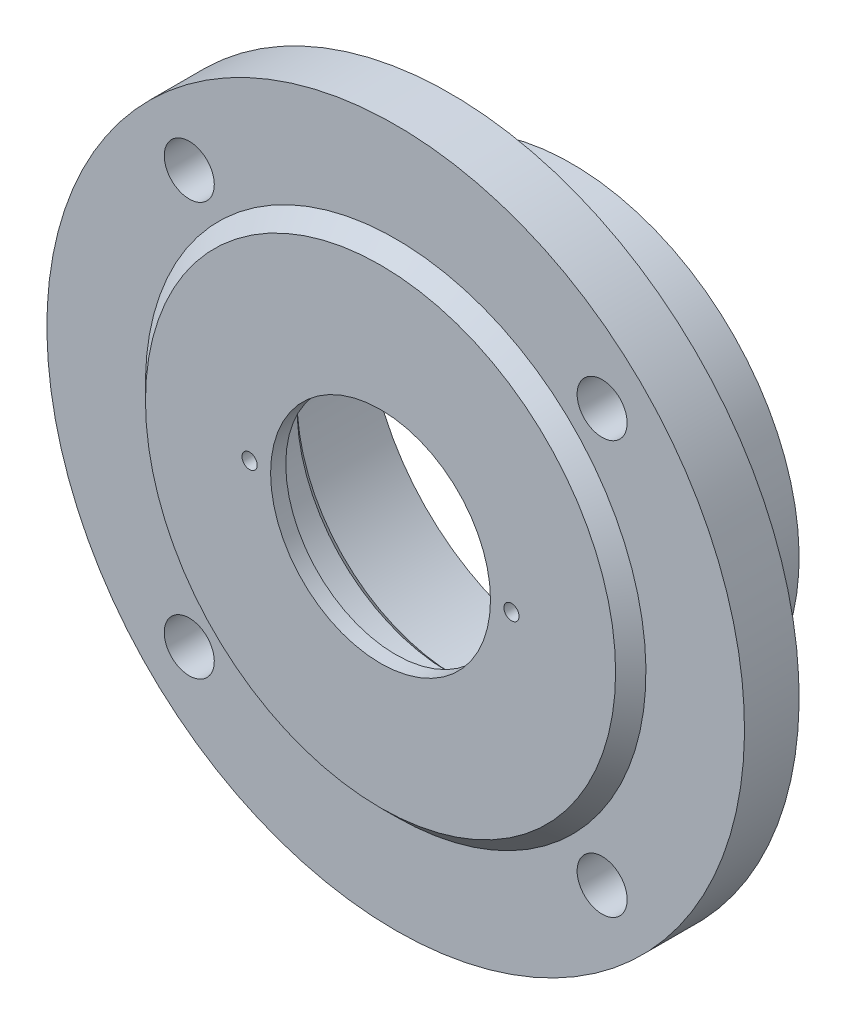
ISO-10303-21;
HEADER;
FILE_DESCRIPTION(('STEP AP214'),'2;1');
FILE_NAME('part.step','',(''),(''),'','','');
FILE_SCHEMA(('AUTOMOTIVE_DESIGN { 1 0 10303 214 1 1 1 1 }'));
ENDSEC;
DATA;
#1=APPLICATION_CONTEXT('core data for automotive mechanical design processes');
#2=APPLICATION_PROTOCOL_DEFINITION('international standard','automotive_design',2000,#1);
#3=PRODUCT_CONTEXT('',#1,'mechanical');
#4=PRODUCT('Part','Part','',(#3));
#5=PRODUCT_RELATED_PRODUCT_CATEGORY('part','',(#4));
#6=PRODUCT_DEFINITION_FORMATION('','',#4);
#7=PRODUCT_DEFINITION_CONTEXT('part definition',#1,'design');
#8=PRODUCT_DEFINITION('design','',#6,#7);
#9=PRODUCT_DEFINITION_SHAPE('','',#8);
#10=(LENGTH_UNIT() NAMED_UNIT(*) SI_UNIT(.MILLI.,.METRE.));
#11=(NAMED_UNIT(*) PLANE_ANGLE_UNIT() SI_UNIT($,.RADIAN.));
#12=(NAMED_UNIT(*) SI_UNIT($,.STERADIAN.) SOLID_ANGLE_UNIT());
#13=UNCERTAINTY_MEASURE_WITH_UNIT(LENGTH_MEASURE(1.E-05),#10,'distance_accuracy_value','');
#14=(GEOMETRIC_REPRESENTATION_CONTEXT(3) GLOBAL_UNCERTAINTY_ASSIGNED_CONTEXT((#13)) GLOBAL_UNIT_ASSIGNED_CONTEXT((#10,
#11,#12)) REPRESENTATION_CONTEXT('',''));
#15=CARTESIAN_POINT('',(0.,0.,0.));
#16=DIRECTION('',(0.,0.,1.));
#17=DIRECTION('',(1.,0.,0.));
#18=AXIS2_PLACEMENT_3D('',#15,#16,#17);
#19=CARTESIAN_POINT('',(0.,33.,-2.));
#20=DIRECTION('',(0.,0.,-1.));
#21=DIRECTION('',(0.,1.,0.));
#22=AXIS2_PLACEMENT_3D('',#19,#20,#21);
#23=PLANE('',#22);
#24=CARTESIAN_POINT('',(27.2236110756825,-27.2236110756816,-2.00000000000002));
#25=DIRECTION('',(0.,0.,1.));
#26=DIRECTION('',(0.,-1.,0.));
#27=AXIS2_PLACEMENT_3D('',#24,#25,#26);
#28=CIRCLE('',#27,3.3);
#29=CARTESIAN_POINT('',(27.2236110756825,-30.5236110756816,-2.00000000000002));
#30=VERTEX_POINT('',#29);
#31=EDGE_CURVE('E116',#30,#30,#28,.T.);
#32=ORIENTED_EDGE('',*,*,#31,.F.);
#33=EDGE_LOOP('',(#32));
#34=FACE_BOUND('',#33,.T.);
#35=CARTESIAN_POINT('',(-27.2236110756819,-27.2236110756822,-2.00000000000002));
#36=DIRECTION('',(0.,0.,1.));
#37=DIRECTION('',(0.,-1.,0.));
#38=AXIS2_PLACEMENT_3D('',#35,#36,#37);
#39=CIRCLE('',#38,3.3);
#40=CARTESIAN_POINT('',(-27.2236110756819,-30.5236110756822,-2.00000000000002));
#41=VERTEX_POINT('',#40);
#42=EDGE_CURVE('E110',#41,#41,#39,.T.);
#43=ORIENTED_EDGE('',*,*,#42,.F.);
#44=EDGE_LOOP('',(#43));
#45=FACE_BOUND('',#44,.T.);
#46=CARTESIAN_POINT('',(-27.2236110756823,27.2236110756818,-2.00000000000001));
#47=DIRECTION('',(0.,0.,1.));
#48=DIRECTION('',(0.,-1.,0.));
#49=AXIS2_PLACEMENT_3D('',#46,#47,#48);
#50=CIRCLE('',#49,3.3);
#51=CARTESIAN_POINT('',(-27.2236110756823,23.9236110756818,-2.00000000000001));
#52=VERTEX_POINT('',#51);
#53=EDGE_CURVE('E104',#52,#52,#50,.T.);
#54=ORIENTED_EDGE('',*,*,#53,.F.);
#55=EDGE_LOOP('',(#54));
#56=FACE_BOUND('',#55,.T.);
#57=CARTESIAN_POINT('',(0.,0.,-2.00000000000001));
#58=DIRECTION('',(0.,0.,1.));
#59=DIRECTION('',(0.,-1.,0.));
#60=AXIS2_PLACEMENT_3D('',#57,#58,#59);
#61=CIRCLE('',#60,33.);
#62=CARTESIAN_POINT('',(0.,-33.,-2.00000000000001));
#63=VERTEX_POINT('',#62);
#64=EDGE_CURVE('E92',#63,#63,#61,.T.);
#65=ORIENTED_EDGE('',*,*,#64,.F.);
#66=EDGE_LOOP('',(#65));
#67=FACE_BOUND('',#66,.T.);
#68=CARTESIAN_POINT('',(0.,0.,-2.00000000000001));
#69=DIRECTION('',(0.,0.,1.));
#70=DIRECTION('',(0.,-1.,0.));
#71=AXIS2_PLACEMENT_3D('',#68,#69,#70);
#72=CIRCLE('',#71,46.);
#73=CARTESIAN_POINT('',(0.,-46.,-2.00000000000002));
#74=VERTEX_POINT('',#73);
#75=EDGE_CURVE('E89',#74,#74,#72,.T.);
#76=ORIENTED_EDGE('',*,*,#75,.T.);
#77=EDGE_LOOP('',(#76));
#78=FACE_BOUND('',#77,.T.);
#79=CARTESIAN_POINT('',(27.2236110756819,27.2236110756822,-2.00000000000001));
#80=DIRECTION('',(0.,0.,1.));
#81=DIRECTION('',(1.,0.,0.));
#82=AXIS2_PLACEMENT_3D('',#79,#80,#81);
#83=CIRCLE('',#82,3.3);
#84=CARTESIAN_POINT('',(30.5236110756819,27.2236110756822,-2.00000000000001));
#85=VERTEX_POINT('',#84);
#86=EDGE_CURVE('E98',#85,#85,#83,.T.);
#87=ORIENTED_EDGE('',*,*,#86,.F.);
#88=EDGE_LOOP('',(#87));
#89=FACE_BOUND('',#88,.T.);
#90=ADVANCED_FACE('F39',(#34,#45,#56,#67,#78,#89),#23,.F.);
#91=CARTESIAN_POINT('',(0.,0.,-2.00000000000001));
#92=DIRECTION('',(0.,0.,-1.));
#93=DIRECTION('',(0.,1.,0.));
#94=AXIS2_PLACEMENT_3D('',#91,#92,#93);
#95=CONICAL_SURFACE('',#94,33.,0.785398163397449);
#96=CARTESIAN_POINT('',(0.,0.,0.));
#97=DIRECTION('',(0.,0.,1.));
#98=DIRECTION('',(0.,-1.,0.));
#99=AXIS2_PLACEMENT_3D('',#96,#97,#98);
#100=CIRCLE('',#99,31.);
#101=CARTESIAN_POINT('',(0.,-31.,0.));
#102=VERTEX_POINT('',#101);
#103=EDGE_CURVE('E10',#102,#102,#100,.T.);
#104=ORIENTED_EDGE('',*,*,#103,.F.);
#105=EDGE_LOOP('',(#104));
#106=FACE_BOUND('',#105,.T.);
#107=ORIENTED_EDGE('',*,*,#64,.T.);
#108=EDGE_LOOP('',(#107));
#109=FACE_BOUND('',#108,.T.);
#110=ADVANCED_FACE('F41',(#106,#109),#95,.T.);
#111=CARTESIAN_POINT('',(0.,14.5,0.));
#112=DIRECTION('',(0.,0.,-1.));
#113=DIRECTION('',(0.,1.,0.));
#114=AXIS2_PLACEMENT_3D('',#111,#112,#113);
#115=PLANE('',#114);
#116=CARTESIAN_POINT('',(17.27,6.50746885276138E-13,0.));
#117=DIRECTION('',(0.,0.,1.));
#118=DIRECTION('',(1.,0.,0.));
#119=AXIS2_PLACEMENT_3D('',#116,#117,#118);
#120=CIRCLE('',#119,0.999999999999821);
#121=CARTESIAN_POINT('',(18.2699999999998,6.50746885276138E-13,0.));
#122=VERTEX_POINT('',#121);
#123=EDGE_CURVE('E123',#122,#122,#120,.T.);
#124=ORIENTED_EDGE('',*,*,#123,.F.);
#125=EDGE_LOOP('',(#124));
#126=FACE_BOUND('',#125,.T.);
#127=CARTESIAN_POINT('',(-17.27,6.50746885276138E-13,0.));
#128=DIRECTION('',(0.,0.,1.));
#129=DIRECTION('',(-1.,0.,0.));
#130=AXIS2_PLACEMENT_3D('',#127,#128,#129);
#131=CIRCLE('',#130,0.999999999999821);
#132=CARTESIAN_POINT('',(-18.2699999999998,6.50746885276138E-13,0.));
#133=VERTEX_POINT('',#132);
#134=EDGE_CURVE('E124',#133,#133,#131,.T.);
#135=ORIENTED_EDGE('',*,*,#134,.F.);
#136=EDGE_LOOP('',(#135));
#137=FACE_BOUND('',#136,.T.);
#138=CARTESIAN_POINT('',(0.,0.,0.));
#139=DIRECTION('',(0.,0.,1.));
#140=DIRECTION('',(0.,-1.,0.));
#141=AXIS2_PLACEMENT_3D('',#138,#139,#140);
#142=CIRCLE('',#141,14.5);
#143=CARTESIAN_POINT('',(0.,-14.5,0.));
#144=VERTEX_POINT('',#143);
#145=EDGE_CURVE('E46',#144,#144,#142,.T.);
#146=ORIENTED_EDGE('',*,*,#145,.F.);
#147=EDGE_LOOP('',(#146));
#148=FACE_BOUND('',#147,.T.);
#149=ORIENTED_EDGE('',*,*,#103,.T.);
#150=EDGE_LOOP('',(#149));
#151=FACE_BOUND('',#150,.T.);
#152=ADVANCED_FACE('F135',(#126,#137,#148,#151),#115,.F.);
#153=CARTESIAN_POINT('',(0.,0.,0.));
#154=DIRECTION('',(0.,0.,1.));
#155=DIRECTION('',(0.,-1.,0.));
#156=AXIS2_PLACEMENT_3D('',#153,#154,#155);
#157=CYLINDRICAL_SURFACE('',#156,14.5);
#158=CARTESIAN_POINT('',(0.,0.,-2.));
#159=DIRECTION('',(0.,0.,1.));
#160=DIRECTION('',(0.,-1.,0.));
#161=AXIS2_PLACEMENT_3D('',#158,#159,#160);
#162=CIRCLE('',#161,14.5);
#163=CARTESIAN_POINT('',(0.,-14.5,-2.00000000000001));
#164=VERTEX_POINT('',#163);
#165=EDGE_CURVE('E50',#164,#164,#162,.T.);
#166=ORIENTED_EDGE('',*,*,#165,.F.);
#167=EDGE_LOOP('',(#166));
#168=FACE_BOUND('',#167,.T.);
#169=ORIENTED_EDGE('',*,*,#145,.T.);
#170=EDGE_LOOP('',(#169));
#171=FACE_BOUND('',#170,.T.);
#172=ADVANCED_FACE('F138',(#168,#171),#157,.F.);
#173=CARTESIAN_POINT('',(0.,20.,-2.));
#174=DIRECTION('',(0.,0.,1.));
#175=DIRECTION('',(0.,-1.,0.));
#176=AXIS2_PLACEMENT_3D('',#173,#174,#175);
#177=PLANE('',#176);
#178=CARTESIAN_POINT('',(17.27,6.50746885276138E-13,-2.));
#179=DIRECTION('',(0.,0.,1.));
#180=DIRECTION('',(0.,-1.,0.));
#181=AXIS2_PLACEMENT_3D('',#178,#179,#180);
#182=CIRCLE('',#181,0.999999999999821);
#183=CARTESIAN_POINT('',(17.27,-0.99999999999917,-2.));
#184=VERTEX_POINT('',#183);
#185=EDGE_CURVE('E119',#184,#184,#182,.F.);
#186=ORIENTED_EDGE('',*,*,#185,.F.);
#187=EDGE_LOOP('',(#186));
#188=FACE_BOUND('',#187,.T.);
#189=CARTESIAN_POINT('',(-17.27,6.50746885276138E-13,-2.));
#190=DIRECTION('',(0.,0.,1.));
#191=DIRECTION('',(0.,-1.,0.));
#192=AXIS2_PLACEMENT_3D('',#189,#190,#191);
#193=CIRCLE('',#192,0.999999999999821);
#194=CARTESIAN_POINT('',(-17.27,-0.99999999999917,-2.));
#195=VERTEX_POINT('',#194);
#196=EDGE_CURVE('E120',#195,#195,#193,.F.);
#197=ORIENTED_EDGE('',*,*,#196,.F.);
#198=EDGE_LOOP('',(#197));
#199=FACE_BOUND('',#198,.T.);
#200=CARTESIAN_POINT('',(0.,0.,-2.));
#201=DIRECTION('',(0.,0.,1.));
#202=DIRECTION('',(0.,-1.,0.));
#203=AXIS2_PLACEMENT_3D('',#200,#201,#202);
#204=CIRCLE('',#203,20.);
#205=CARTESIAN_POINT('',(0.,-20.,-2.00000000000001));
#206=VERTEX_POINT('',#205);
#207=EDGE_CURVE('E54',#206,#206,#204,.T.);
#208=ORIENTED_EDGE('',*,*,#207,.F.);
#209=EDGE_LOOP('',(#208));
#210=FACE_BOUND('',#209,.T.);
#211=ORIENTED_EDGE('',*,*,#165,.T.);
#212=EDGE_LOOP('',(#211));
#213=FACE_BOUND('',#212,.T.);
#214=ADVANCED_FACE('F149',(#188,#199,#210,#213),#177,.F.);
#215=CARTESIAN_POINT('',(0.,0.,0.));
#216=DIRECTION('',(0.,0.,1.));
#217=DIRECTION('',(0.,-1.,0.));
#218=AXIS2_PLACEMENT_3D('',#215,#216,#217);
#219=CYLINDRICAL_SURFACE('',#218,20.);
#220=CARTESIAN_POINT('',(0.,0.,-9.));
#221=DIRECTION('',(0.,0.,1.));
#222=DIRECTION('',(0.,-1.,0.));
#223=AXIS2_PLACEMENT_3D('',#220,#221,#222);
#224=CIRCLE('',#223,20.);
#225=CARTESIAN_POINT('',(0.,-20.,-9.00000000000001));
#226=VERTEX_POINT('',#225);
#227=EDGE_CURVE('E59',#226,#226,#224,.T.);
#228=ORIENTED_EDGE('',*,*,#227,.F.);
#229=EDGE_LOOP('',(#228));
#230=FACE_BOUND('',#229,.T.);
#231=ORIENTED_EDGE('',*,*,#207,.T.);
#232=EDGE_LOOP('',(#231));
#233=FACE_BOUND('',#232,.T.);
#234=ADVANCED_FACE('F152',(#230,#233),#219,.F.);
#235=CARTESIAN_POINT('',(0.,0.,-9.));
#236=DIRECTION('',(0.,0.,-1.));
#237=DIRECTION('',(0.,1.,0.));
#238=AXIS2_PLACEMENT_3D('',#235,#236,#237);
#239=CONICAL_SURFACE('',#238,20.,0.785398163397446);
#240=CARTESIAN_POINT('',(0.,0.,-10.));
#241=DIRECTION('',(0.,0.,1.));
#242=DIRECTION('',(0.,-1.,0.));
#243=AXIS2_PLACEMENT_3D('',#240,#241,#242);
#244=CIRCLE('',#243,21.);
#245=CARTESIAN_POINT('',(0.,-21.,-10.));
#246=VERTEX_POINT('',#245);
#247=EDGE_CURVE('E62',#246,#246,#244,.T.);
#248=ORIENTED_EDGE('',*,*,#247,.F.);
#249=EDGE_LOOP('',(#248));
#250=FACE_BOUND('',#249,.T.);
#251=ORIENTED_EDGE('',*,*,#227,.T.);
#252=EDGE_LOOP('',(#251));
#253=FACE_BOUND('',#252,.T.);
#254=ADVANCED_FACE('F213',(#250,#253),#239,.F.);
#255=CARTESIAN_POINT('',(0.,21.,-10.));
#256=DIRECTION('',(0.,0.,1.));
#257=DIRECTION('',(0.,-1.,0.));
#258=AXIS2_PLACEMENT_3D('',#255,#256,#257);
#259=PLANE('',#258);
#260=CARTESIAN_POINT('',(0.,0.,-10.));
#261=DIRECTION('',(0.,0.,1.));
#262=DIRECTION('',(0.,-1.,0.));
#263=AXIS2_PLACEMENT_3D('',#260,#261,#262);
#264=CIRCLE('',#263,26.);
#265=CARTESIAN_POINT('',(0.,-26.,-10.));
#266=VERTEX_POINT('',#265);
#267=EDGE_CURVE('E65',#266,#266,#264,.T.);
#268=ORIENTED_EDGE('',*,*,#267,.F.);
#269=EDGE_LOOP('',(#268));
#270=FACE_BOUND('',#269,.T.);
#271=ORIENTED_EDGE('',*,*,#247,.T.);
#272=EDGE_LOOP('',(#271));
#273=FACE_BOUND('',#272,.T.);
#274=ADVANCED_FACE('F209',(#270,#273),#259,.F.);
#275=CARTESIAN_POINT('',(0.,0.,-11.));
#276=DIRECTION('',(0.,0.,1.));
#277=DIRECTION('',(0.,-1.,0.));
#278=AXIS2_PLACEMENT_3D('',#275,#276,#277);
#279=TOROIDAL_SURFACE('',#278,26.,1.);
#280=CARTESIAN_POINT('',(0.,0.,-11.));
#281=DIRECTION('',(0.,0.,1.));
#282=DIRECTION('',(0.,-1.,0.));
#283=AXIS2_PLACEMENT_3D('',#280,#281,#282);
#284=CIRCLE('',#283,27.);
#285=CARTESIAN_POINT('',(0.,-27.,-11.));
#286=VERTEX_POINT('',#285);
#287=EDGE_CURVE('E68',#286,#286,#284,.T.);
#288=ORIENTED_EDGE('',*,*,#287,.F.);
#289=EDGE_LOOP('',(#288));
#290=FACE_BOUND('',#289,.T.);
#291=ORIENTED_EDGE('',*,*,#267,.T.);
#292=EDGE_LOOP('',(#291));
#293=FACE_BOUND('',#292,.T.);
#294=ADVANCED_FACE('F205',(#290,#293),#279,.F.);
#295=CARTESIAN_POINT('',(0.,0.,0.));
#296=DIRECTION('',(0.,0.,1.));
#297=DIRECTION('',(0.,-1.,0.));
#298=AXIS2_PLACEMENT_3D('',#295,#296,#297);
#299=CYLINDRICAL_SURFACE('',#298,27.);
#300=CARTESIAN_POINT('',(0.,0.,-25.2));
#301=DIRECTION('',(0.,0.,1.));
#302=DIRECTION('',(0.,-1.,0.));
#303=AXIS2_PLACEMENT_3D('',#300,#301,#302);
#304=CIRCLE('',#303,27.);
#305=CARTESIAN_POINT('',(0.,-27.,-25.2));
#306=VERTEX_POINT('',#305);
#307=EDGE_CURVE('E71',#306,#306,#304,.T.);
#308=ORIENTED_EDGE('',*,*,#307,.F.);
#309=EDGE_LOOP('',(#308));
#310=FACE_BOUND('',#309,.T.);
#311=ORIENTED_EDGE('',*,*,#287,.T.);
#312=EDGE_LOOP('',(#311));
#313=FACE_BOUND('',#312,.T.);
#314=ADVANCED_FACE('F201',(#310,#313),#299,.F.);
#315=CARTESIAN_POINT('',(0.,27.,-25.2));
#316=DIRECTION('',(0.,0.,1.));
#317=DIRECTION('',(0.,-1.,0.));
#318=AXIS2_PLACEMENT_3D('',#315,#316,#317);
#319=PLANE('',#318);
#320=CARTESIAN_POINT('',(0.,0.,-25.2));
#321=DIRECTION('',(0.,0.,1.));
#322=DIRECTION('',(0.,-1.,0.));
#323=AXIS2_PLACEMENT_3D('',#320,#321,#322);
#324=CIRCLE('',#323,30.);
#325=CARTESIAN_POINT('',(0.,-30.,-25.2));
#326=VERTEX_POINT('',#325);
#327=EDGE_CURVE('E74',#326,#326,#324,.T.);
#328=ORIENTED_EDGE('',*,*,#327,.F.);
#329=EDGE_LOOP('',(#328));
#330=FACE_BOUND('',#329,.T.);
#331=ORIENTED_EDGE('',*,*,#307,.T.);
#332=EDGE_LOOP('',(#331));
#333=FACE_BOUND('',#332,.T.);
#334=ADVANCED_FACE('F197',(#330,#333),#319,.F.);
#335=CARTESIAN_POINT('',(0.,0.,0.));
#336=DIRECTION('',(0.,0.,1.));
#337=DIRECTION('',(0.,-1.,0.));
#338=AXIS2_PLACEMENT_3D('',#335,#336,#337);
#339=CYLINDRICAL_SURFACE('',#338,30.);
#340=CARTESIAN_POINT('',(0.,0.,-15.2));
#341=DIRECTION('',(0.,0.,1.));
#342=DIRECTION('',(0.,-1.,0.));
#343=AXIS2_PLACEMENT_3D('',#340,#341,#342);
#344=CIRCLE('',#343,30.);
#345=CARTESIAN_POINT('',(0.,-30.,-15.2));
#346=VERTEX_POINT('',#345);
#347=EDGE_CURVE('E77',#346,#346,#344,.T.);
#348=ORIENTED_EDGE('',*,*,#347,.F.);
#349=EDGE_LOOP('',(#348));
#350=FACE_BOUND('',#349,.T.);
#351=ORIENTED_EDGE('',*,*,#327,.T.);
#352=EDGE_LOOP('',(#351));
#353=FACE_BOUND('',#352,.T.);
#354=ADVANCED_FACE('F193',(#350,#353),#339,.T.);
#355=CARTESIAN_POINT('',(0.,0.,-15.2));
#356=DIRECTION('',(0.,0.,1.));
#357=DIRECTION('',(0.,-1.,0.));
#358=AXIS2_PLACEMENT_3D('',#355,#356,#357);
#359=TOROIDAL_SURFACE('',#358,31.,1.);
#360=CARTESIAN_POINT('',(0.,0.,-14.2));
#361=DIRECTION('',(0.,0.,1.));
#362=DIRECTION('',(0.,-1.,0.));
#363=AXIS2_PLACEMENT_3D('',#360,#361,#362);
#364=CIRCLE('',#363,31.);
#365=CARTESIAN_POINT('',(0.,-31.,-14.2));
#366=VERTEX_POINT('',#365);
#367=EDGE_CURVE('E80',#366,#366,#364,.T.);
#368=ORIENTED_EDGE('',*,*,#367,.F.);
#369=EDGE_LOOP('',(#368));
#370=FACE_BOUND('',#369,.T.);
#371=ORIENTED_EDGE('',*,*,#347,.T.);
#372=EDGE_LOOP('',(#371));
#373=FACE_BOUND('',#372,.T.);
#374=ADVANCED_FACE('F189',(#370,#373),#359,.F.);
#375=CARTESIAN_POINT('',(0.,0.,0.));
#376=DIRECTION('',(0.,0.,1.));
#377=DIRECTION('',(0.,-1.,0.));
#378=AXIS2_PLACEMENT_3D('',#375,#376,#377);
#379=CYLINDRICAL_SURFACE('',#378,31.);
#380=CARTESIAN_POINT('',(0.,0.,-9.20000000000001));
#381=DIRECTION('',(0.,0.,1.));
#382=DIRECTION('',(0.,-1.,0.));
#383=AXIS2_PLACEMENT_3D('',#380,#381,#382);
#384=CIRCLE('',#383,31.);
#385=CARTESIAN_POINT('',(0.,-31.,-9.20000000000001));
#386=VERTEX_POINT('',#385);
#387=EDGE_CURVE('E83',#386,#386,#384,.T.);
#388=ORIENTED_EDGE('',*,*,#387,.F.);
#389=EDGE_LOOP('',(#388));
#390=FACE_BOUND('',#389,.T.);
#391=ORIENTED_EDGE('',*,*,#367,.T.);
#392=EDGE_LOOP('',(#391));
#393=FACE_BOUND('',#392,.T.);
#394=ADVANCED_FACE('F185',(#390,#393),#379,.T.);
#395=CARTESIAN_POINT('',(0.,46.,-9.2));
#396=DIRECTION('',(0.,0.,1.));
#397=DIRECTION('',(0.,-1.,0.));
#398=AXIS2_PLACEMENT_3D('',#395,#396,#397);
#399=PLANE('',#398);
#400=CARTESIAN_POINT('',(27.2236110756825,-27.2236110756816,-9.20000000000001));
#401=DIRECTION('',(0.,0.,1.));
#402=DIRECTION('',(0.,-1.,0.));
#403=AXIS2_PLACEMENT_3D('',#400,#401,#402);
#404=CIRCLE('',#403,3.3);
#405=CARTESIAN_POINT('',(27.2236110756825,-30.5236110756816,-9.20000000000001));
#406=VERTEX_POINT('',#405);
#407=EDGE_CURVE('E113',#406,#406,#404,.T.);
#408=ORIENTED_EDGE('',*,*,#407,.T.);
#409=EDGE_LOOP('',(#408));
#410=FACE_BOUND('',#409,.T.);
#411=CARTESIAN_POINT('',(-27.2236110756819,-27.2236110756822,-9.20000000000001));
#412=DIRECTION('',(0.,0.,1.));
#413=DIRECTION('',(0.,-1.,0.));
#414=AXIS2_PLACEMENT_3D('',#411,#412,#413);
#415=CIRCLE('',#414,3.3);
#416=CARTESIAN_POINT('',(-27.2236110756819,-30.5236110756822,-9.20000000000001));
#417=VERTEX_POINT('',#416);
#418=EDGE_CURVE('E107',#417,#417,#415,.T.);
#419=ORIENTED_EDGE('',*,*,#418,.T.);
#420=EDGE_LOOP('',(#419));
#421=FACE_BOUND('',#420,.T.);
#422=CARTESIAN_POINT('',(-27.2236110756823,27.2236110756818,-9.2));
#423=DIRECTION('',(0.,0.,1.));
#424=DIRECTION('',(0.,-1.,0.));
#425=AXIS2_PLACEMENT_3D('',#422,#423,#424);
#426=CIRCLE('',#425,3.3);
#427=CARTESIAN_POINT('',(-27.2236110756823,23.9236110756818,-9.2));
#428=VERTEX_POINT('',#427);
#429=EDGE_CURVE('E101',#428,#428,#426,.T.);
#430=ORIENTED_EDGE('',*,*,#429,.T.);
#431=EDGE_LOOP('',(#430));
#432=FACE_BOUND('',#431,.T.);
#433=CARTESIAN_POINT('',(27.2236110756819,27.2236110756822,-9.2));
#434=DIRECTION('',(0.,0.,1.));
#435=DIRECTION('',(0.,-1.,0.));
#436=AXIS2_PLACEMENT_3D('',#433,#434,#435);
#437=CIRCLE('',#436,3.3);
#438=CARTESIAN_POINT('',(27.2236110756819,23.9236110756822,-9.2));
#439=VERTEX_POINT('',#438);
#440=EDGE_CURVE('E95',#439,#439,#437,.T.);
#441=ORIENTED_EDGE('',*,*,#440,.T.);
#442=EDGE_LOOP('',(#441));
#443=FACE_BOUND('',#442,.T.);
#444=CARTESIAN_POINT('',(0.,0.,-9.20000000000001));
#445=DIRECTION('',(0.,0.,1.));
#446=DIRECTION('',(0.,-1.,0.));
#447=AXIS2_PLACEMENT_3D('',#444,#445,#446);
#448=CIRCLE('',#447,46.);
#449=CARTESIAN_POINT('',(0.,-46.,-9.20000000000002));
#450=VERTEX_POINT('',#449);
#451=EDGE_CURVE('E86',#450,#450,#448,.T.);
#452=ORIENTED_EDGE('',*,*,#451,.F.);
#453=EDGE_LOOP('',(#452));
#454=FACE_BOUND('',#453,.T.);
#455=ORIENTED_EDGE('',*,*,#387,.T.);
#456=EDGE_LOOP('',(#455));
#457=FACE_BOUND('',#456,.T.);
#458=ADVANCED_FACE('F182',(#410,#421,#432,#443,#454,#457),#399,.F.);
#459=CARTESIAN_POINT('',(0.,0.,0.));
#460=DIRECTION('',(0.,0.,1.));
#461=DIRECTION('',(0.,-1.,0.));
#462=AXIS2_PLACEMENT_3D('',#459,#460,#461);
#463=CYLINDRICAL_SURFACE('',#462,46.);
#464=ORIENTED_EDGE('',*,*,#75,.F.);
#465=EDGE_LOOP('',(#464));
#466=FACE_BOUND('',#465,.T.);
#467=ORIENTED_EDGE('',*,*,#451,.T.);
#468=EDGE_LOOP('',(#467));
#469=FACE_BOUND('',#468,.T.);
#470=ADVANCED_FACE('F179',(#466,#469),#463,.T.);
#471=CARTESIAN_POINT('',(27.2236110756819,27.2236110756822,-2.00000000000001));
#472=DIRECTION('',(0.,0.,1.));
#473=DIRECTION('',(1.,0.,0.));
#474=AXIS2_PLACEMENT_3D('',#471,#472,#473);
#475=CYLINDRICAL_SURFACE('',#474,3.3);
#476=ORIENTED_EDGE('',*,*,#440,.F.);
#477=EDGE_LOOP('',(#476));
#478=FACE_BOUND('',#477,.T.);
#479=ORIENTED_EDGE('',*,*,#86,.T.);
#480=EDGE_LOOP('',(#479));
#481=FACE_BOUND('',#480,.T.);
#482=ADVANCED_FACE('F177',(#478,#481),#475,.F.);
#483=CARTESIAN_POINT('',(-27.2236110756823,27.2236110756818,-2.00000000000001));
#484=DIRECTION('',(0.,0.,1.));
#485=DIRECTION('',(0.,-1.,0.));
#486=AXIS2_PLACEMENT_3D('',#483,#484,#485);
#487=CYLINDRICAL_SURFACE('',#486,3.3);
#488=ORIENTED_EDGE('',*,*,#429,.F.);
#489=EDGE_LOOP('',(#488));
#490=FACE_BOUND('',#489,.T.);
#491=ORIENTED_EDGE('',*,*,#53,.T.);
#492=EDGE_LOOP('',(#491));
#493=FACE_BOUND('',#492,.T.);
#494=ADVANCED_FACE('F266',(#490,#493),#487,.F.);
#495=CARTESIAN_POINT('',(-27.2236110756819,-27.2236110756822,-2.00000000000002));
#496=DIRECTION('',(0.,0.,1.));
#497=DIRECTION('',(0.,-1.,0.));
#498=AXIS2_PLACEMENT_3D('',#495,#496,#497);
#499=CYLINDRICAL_SURFACE('',#498,3.3);
#500=ORIENTED_EDGE('',*,*,#418,.F.);
#501=EDGE_LOOP('',(#500));
#502=FACE_BOUND('',#501,.T.);
#503=ORIENTED_EDGE('',*,*,#42,.T.);
#504=EDGE_LOOP('',(#503));
#505=FACE_BOUND('',#504,.T.);
#506=ADVANCED_FACE('F277',(#502,#505),#499,.F.);
#507=CARTESIAN_POINT('',(27.2236110756825,-27.2236110756816,-2.00000000000002));
#508=DIRECTION('',(0.,0.,1.));
#509=DIRECTION('',(0.,-1.,0.));
#510=AXIS2_PLACEMENT_3D('',#507,#508,#509);
#511=CYLINDRICAL_SURFACE('',#510,3.3);
#512=ORIENTED_EDGE('',*,*,#407,.F.);
#513=EDGE_LOOP('',(#512));
#514=FACE_BOUND('',#513,.T.);
#515=ORIENTED_EDGE('',*,*,#31,.T.);
#516=EDGE_LOOP('',(#515));
#517=FACE_BOUND('',#516,.T.);
#518=ADVANCED_FACE('F145',(#514,#517),#511,.F.);
#519=CARTESIAN_POINT('',(-17.27,6.50746885276138E-13,-25.201));
#520=DIRECTION('',(0.,0.,1.));
#521=DIRECTION('',(1.,0.,0.));
#522=AXIS2_PLACEMENT_3D('',#519,#520,#521);
#523=CYLINDRICAL_SURFACE('',#522,0.999999999999821);
#524=ORIENTED_EDGE('',*,*,#134,.T.);
#525=EDGE_LOOP('',(#524));
#526=FACE_BOUND('',#525,.T.);
#527=ORIENTED_EDGE('',*,*,#196,.T.);
#528=EDGE_LOOP('',(#527));
#529=FACE_BOUND('',#528,.T.);
#530=ADVANCED_FACE('F142',(#526,#529),#523,.F.);
#531=CARTESIAN_POINT('',(17.27,6.50746885276138E-13,-25.201));
#532=DIRECTION('',(0.,0.,1.));
#533=DIRECTION('',(1.,0.,0.));
#534=AXIS2_PLACEMENT_3D('',#531,#532,#533);
#535=CYLINDRICAL_SURFACE('',#534,0.999999999999821);
#536=ORIENTED_EDGE('',*,*,#123,.T.);
#537=EDGE_LOOP('',(#536));
#538=FACE_BOUND('',#537,.T.);
#539=ORIENTED_EDGE('',*,*,#185,.T.);
#540=EDGE_LOOP('',(#539));
#541=FACE_BOUND('',#540,.T.);
#542=ADVANCED_FACE('F132',(#538,#541),#535,.F.);
#543=CLOSED_SHELL('',(#90,#110,#152,#172,#214,#234,#254,#274,#294,#314,#334,#354,#374,#394,#458,
#470,#482,#494,#506,#518,#530,#542));
#544=MANIFOLD_SOLID_BREP('B2',#543);
#545=ADVANCED_BREP_SHAPE_REPRESENTATION('',(#18,#544),#14);
#546=SHAPE_DEFINITION_REPRESENTATION(#9,#545);
ENDSEC;
END-ISO-10303-21;
